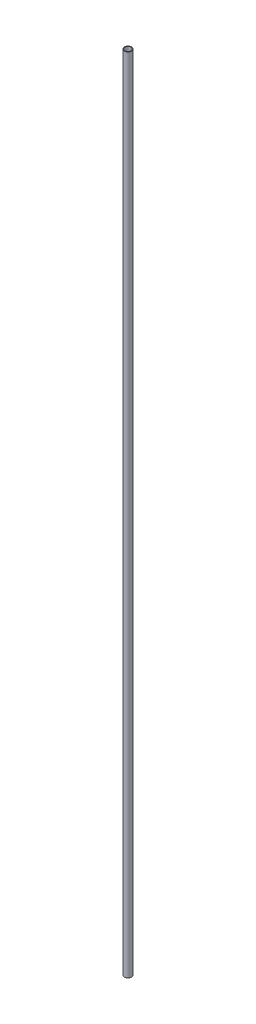
ISO-10303-21;
HEADER;
FILE_DESCRIPTION(('STEP AP214'),'2;1');
FILE_NAME('part.step','',(''),(''),'','','');
FILE_SCHEMA(('AUTOMOTIVE_DESIGN { 1 0 10303 214 1 1 1 1 }'));
ENDSEC;
DATA;
#1=APPLICATION_CONTEXT('core data for automotive mechanical design processes');
#2=APPLICATION_PROTOCOL_DEFINITION('international standard','automotive_design',2000,#1);
#3=PRODUCT_CONTEXT('',#1,'mechanical');
#4=PRODUCT('Part','Part','',(#3));
#5=PRODUCT_RELATED_PRODUCT_CATEGORY('part','',(#4));
#6=PRODUCT_DEFINITION_FORMATION('','',#4);
#7=PRODUCT_DEFINITION_CONTEXT('part definition',#1,'design');
#8=PRODUCT_DEFINITION('design','',#6,#7);
#9=PRODUCT_DEFINITION_SHAPE('','',#8);
#10=(LENGTH_UNIT() NAMED_UNIT(*) SI_UNIT(.MILLI.,.METRE.));
#11=(NAMED_UNIT(*) PLANE_ANGLE_UNIT() SI_UNIT($,.RADIAN.));
#12=(NAMED_UNIT(*) SI_UNIT($,.STERADIAN.) SOLID_ANGLE_UNIT());
#13=UNCERTAINTY_MEASURE_WITH_UNIT(LENGTH_MEASURE(1.E-05),#10,'distance_accuracy_value','');
#14=(GEOMETRIC_REPRESENTATION_CONTEXT(3) GLOBAL_UNCERTAINTY_ASSIGNED_CONTEXT((#13)) GLOBAL_UNIT_ASSIGNED_CONTEXT((#10,
#11,#12)) REPRESENTATION_CONTEXT('',''));
#15=CARTESIAN_POINT('',(0.,0.,0.));
#16=DIRECTION('',(0.,0.,1.));
#17=DIRECTION('',(1.,0.,0.));
#18=AXIS2_PLACEMENT_3D('',#15,#16,#17);
#19=CARTESIAN_POINT('',(0.,1399.5,0.));
#20=DIRECTION('',(0.,1.,0.));
#21=DIRECTION('',(0.,0.,1.));
#22=AXIS2_PLACEMENT_3D('',#19,#20,#21);
#23=PLANE('',#22);
#24=CARTESIAN_POINT('',(0.,1399.5,0.));
#25=DIRECTION('',(0.,1.,0.));
#26=DIRECTION('',(0.,0.,1.));
#27=AXIS2_PLACEMENT_3D('',#24,#25,#26);
#28=CIRCLE('',#27,6.35);
#29=CARTESIAN_POINT('',(0.,1399.5,6.35));
#30=VERTEX_POINT('',#29);
#31=EDGE_CURVE('E10',#30,#30,#28,.T.);
#32=ORIENTED_EDGE('',*,*,#31,.T.);
#33=EDGE_LOOP('',(#32));
#34=FACE_BOUND('',#33,.T.);
#35=CARTESIAN_POINT('',(0.,1399.5,0.));
#36=DIRECTION('',(0.,1.,0.));
#37=DIRECTION('',(0.,0.,1.));
#38=AXIS2_PLACEMENT_3D('',#35,#36,#37);
#39=CIRCLE('',#38,5.35);
#40=CARTESIAN_POINT('',(0.,1399.5,5.35));
#41=VERTEX_POINT('',#40);
#42=EDGE_CURVE('E42',#41,#41,#39,.T.);
#43=ORIENTED_EDGE('',*,*,#42,.F.);
#44=EDGE_LOOP('',(#43));
#45=FACE_BOUND('',#44,.T.);
#46=ADVANCED_FACE('F31',(#34,#45),#23,.T.);
#47=CARTESIAN_POINT('',(0.,0.,0.));
#48=DIRECTION('',(0.,1.,0.));
#49=DIRECTION('',(0.,0.,1.));
#50=AXIS2_PLACEMENT_3D('',#47,#48,#49);
#51=PLANE('',#50);
#52=CARTESIAN_POINT('',(0.,0.,0.));
#53=DIRECTION('',(0.,1.,0.));
#54=DIRECTION('',(0.,0.,1.));
#55=AXIS2_PLACEMENT_3D('',#52,#53,#54);
#56=CIRCLE('',#55,6.35);
#57=CARTESIAN_POINT('',(0.,0.,6.35));
#58=VERTEX_POINT('',#57);
#59=EDGE_CURVE('E35',#58,#58,#56,.T.);
#60=ORIENTED_EDGE('',*,*,#59,.F.);
#61=EDGE_LOOP('',(#60));
#62=FACE_BOUND('',#61,.T.);
#63=CARTESIAN_POINT('',(0.,0.,0.));
#64=DIRECTION('',(0.,1.,0.));
#65=DIRECTION('',(0.,0.,1.));
#66=AXIS2_PLACEMENT_3D('',#63,#64,#65);
#67=CIRCLE('',#66,5.35);
#68=CARTESIAN_POINT('',(0.,0.,5.35));
#69=VERTEX_POINT('',#68);
#70=EDGE_CURVE('E44',#69,#69,#67,.T.);
#71=ORIENTED_EDGE('',*,*,#70,.T.);
#72=EDGE_LOOP('',(#71));
#73=FACE_BOUND('',#72,.T.);
#74=ADVANCED_FACE('F54',(#62,#73),#51,.F.);
#75=CARTESIAN_POINT('',(0.,1399.5,0.));
#76=DIRECTION('',(0.,-1.,0.));
#77=DIRECTION('',(0.,0.,-1.));
#78=AXIS2_PLACEMENT_3D('',#75,#76,#77);
#79=CYLINDRICAL_SURFACE('',#78,6.35);
#80=ORIENTED_EDGE('',*,*,#31,.F.);
#81=EDGE_LOOP('',(#80));
#82=FACE_BOUND('',#81,.T.);
#83=ORIENTED_EDGE('',*,*,#59,.T.);
#84=EDGE_LOOP('',(#83));
#85=FACE_BOUND('',#84,.T.);
#86=ADVANCED_FACE('F33',(#82,#85),#79,.T.);
#87=CARTESIAN_POINT('',(0.,1399.5,0.));
#88=DIRECTION('',(0.,-1.,0.));
#89=DIRECTION('',(0.,0.,-1.));
#90=AXIS2_PLACEMENT_3D('',#87,#88,#89);
#91=CYLINDRICAL_SURFACE('',#90,5.35);
#92=ORIENTED_EDGE('',*,*,#42,.T.);
#93=EDGE_LOOP('',(#92));
#94=FACE_BOUND('',#93,.T.);
#95=ORIENTED_EDGE('',*,*,#70,.F.);
#96=EDGE_LOOP('',(#95));
#97=FACE_BOUND('',#96,.T.);
#98=ADVANCED_FACE('F50',(#94,#97),#91,.F.);
#99=CLOSED_SHELL('',(#46,#74,#86,#98));
#100=MANIFOLD_SOLID_BREP('B2',#99);
#101=ADVANCED_BREP_SHAPE_REPRESENTATION('',(#18,#100),#14);
#102=SHAPE_DEFINITION_REPRESENTATION(#9,#101);
ENDSEC;
END-ISO-10303-21;
